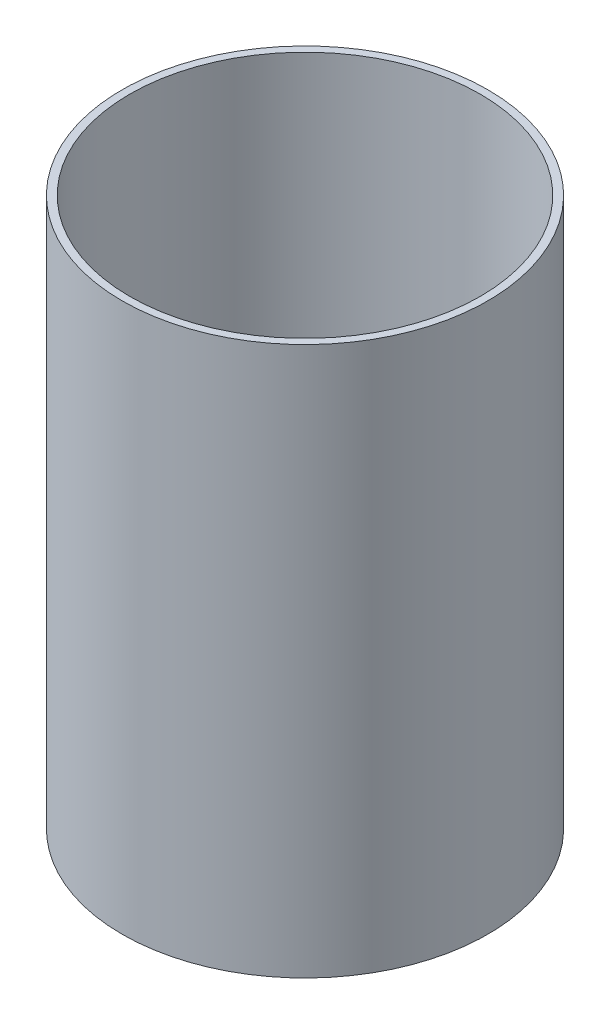
ISO-10303-21;
HEADER;
FILE_DESCRIPTION(('STEP AP214'),'2;1');
FILE_NAME('part.step','',(''),(''),'','','');
FILE_SCHEMA(('AUTOMOTIVE_DESIGN { 1 0 10303 214 1 1 1 1 }'));
ENDSEC;
DATA;
#1=APPLICATION_CONTEXT('core data for automotive mechanical design processes');
#2=APPLICATION_PROTOCOL_DEFINITION('international standard','automotive_design',2000,#1);
#3=PRODUCT_CONTEXT('',#1,'mechanical');
#4=PRODUCT('Part','Part','',(#3));
#5=PRODUCT_RELATED_PRODUCT_CATEGORY('part','',(#4));
#6=PRODUCT_DEFINITION_FORMATION('','',#4);
#7=PRODUCT_DEFINITION_CONTEXT('part definition',#1,'design');
#8=PRODUCT_DEFINITION('design','',#6,#7);
#9=PRODUCT_DEFINITION_SHAPE('','',#8);
#10=(LENGTH_UNIT() NAMED_UNIT(*) SI_UNIT(.MILLI.,.METRE.));
#11=(NAMED_UNIT(*) PLANE_ANGLE_UNIT() SI_UNIT($,.RADIAN.));
#12=(NAMED_UNIT(*) SI_UNIT($,.STERADIAN.) SOLID_ANGLE_UNIT());
#13=UNCERTAINTY_MEASURE_WITH_UNIT(LENGTH_MEASURE(1.E-05),#10,'distance_accuracy_value','');
#14=(GEOMETRIC_REPRESENTATION_CONTEXT(3) GLOBAL_UNCERTAINTY_ASSIGNED_CONTEXT((#13)) GLOBAL_UNIT_ASSIGNED_CONTEXT((#10,
#11,#12)) REPRESENTATION_CONTEXT('',''));
#15=CARTESIAN_POINT('',(0.,0.,0.));
#16=DIRECTION('',(0.,0.,1.));
#17=DIRECTION('',(1.,0.,0.));
#18=AXIS2_PLACEMENT_3D('',#15,#16,#17);
#19=CARTESIAN_POINT('',(0.,457.2,0.));
#20=DIRECTION('',(0.,1.,0.));
#21=DIRECTION('',(0.,0.,1.));
#22=AXIS2_PLACEMENT_3D('',#19,#20,#21);
#23=PLANE('',#22);
#24=CARTESIAN_POINT('',(0.,457.2,0.));
#25=DIRECTION('',(0.,1.,0.));
#26=DIRECTION('',(0.,0.,1.));
#27=AXIS2_PLACEMENT_3D('',#24,#25,#26);
#28=CIRCLE('',#27,152.4);
#29=CARTESIAN_POINT('',(0.,457.2,152.4));
#30=VERTEX_POINT('',#29);
#31=EDGE_CURVE('E10',#30,#30,#28,.T.);
#32=ORIENTED_EDGE('',*,*,#31,.T.);
#33=EDGE_LOOP('',(#32));
#34=FACE_BOUND('',#33,.T.);
#35=CARTESIAN_POINT('',(0.,457.2,0.));
#36=DIRECTION('',(0.,1.,0.));
#37=DIRECTION('',(0.,0.,1.));
#38=AXIS2_PLACEMENT_3D('',#35,#36,#37);
#39=CIRCLE('',#38,146.05);
#40=CARTESIAN_POINT('',(0.,457.2,146.05));
#41=VERTEX_POINT('',#40);
#42=EDGE_CURVE('E44',#41,#41,#39,.T.);
#43=ORIENTED_EDGE('',*,*,#42,.F.);
#44=EDGE_LOOP('',(#43));
#45=FACE_BOUND('',#44,.T.);
#46=ADVANCED_FACE('F33',(#34,#45),#23,.T.);
#47=CARTESIAN_POINT('',(0.,0.,0.));
#48=DIRECTION('',(0.,1.,0.));
#49=DIRECTION('',(0.,0.,1.));
#50=AXIS2_PLACEMENT_3D('',#47,#48,#49);
#51=PLANE('',#50);
#52=CARTESIAN_POINT('',(0.,0.,0.));
#53=DIRECTION('',(0.,1.,0.));
#54=DIRECTION('',(0.,0.,1.));
#55=AXIS2_PLACEMENT_3D('',#52,#53,#54);
#56=CIRCLE('',#55,152.4);
#57=CARTESIAN_POINT('',(0.,0.,152.4));
#58=VERTEX_POINT('',#57);
#59=EDGE_CURVE('E37',#58,#58,#56,.T.);
#60=ORIENTED_EDGE('',*,*,#59,.F.);
#61=EDGE_LOOP('',(#60));
#62=FACE_BOUND('',#61,.T.);
#63=CARTESIAN_POINT('',(0.,0.,0.));
#64=DIRECTION('',(0.,1.,0.));
#65=DIRECTION('',(0.,0.,1.));
#66=AXIS2_PLACEMENT_3D('',#63,#64,#65);
#67=CIRCLE('',#66,146.05);
#68=CARTESIAN_POINT('',(0.,0.,146.05));
#69=VERTEX_POINT('',#68);
#70=EDGE_CURVE('E46',#69,#69,#67,.T.);
#71=ORIENTED_EDGE('',*,*,#70,.T.);
#72=EDGE_LOOP('',(#71));
#73=FACE_BOUND('',#72,.T.);
#74=ADVANCED_FACE('F56',(#62,#73),#51,.F.);
#75=CARTESIAN_POINT('',(0.,457.2,0.));
#76=DIRECTION('',(0.,-1.,0.));
#77=DIRECTION('',(0.,0.,-1.));
#78=AXIS2_PLACEMENT_3D('',#75,#76,#77);
#79=CYLINDRICAL_SURFACE('',#78,152.4);
#80=ORIENTED_EDGE('',*,*,#31,.F.);
#81=EDGE_LOOP('',(#80));
#82=FACE_BOUND('',#81,.T.);
#83=ORIENTED_EDGE('',*,*,#59,.T.);
#84=EDGE_LOOP('',(#83));
#85=FACE_BOUND('',#84,.T.);
#86=ADVANCED_FACE('F35',(#82,#85),#79,.T.);
#87=CARTESIAN_POINT('',(0.,457.2,0.));
#88=DIRECTION('',(0.,-1.,0.));
#89=DIRECTION('',(0.,0.,-1.));
#90=AXIS2_PLACEMENT_3D('',#87,#88,#89);
#91=CYLINDRICAL_SURFACE('',#90,146.05);
#92=ORIENTED_EDGE('',*,*,#42,.T.);
#93=EDGE_LOOP('',(#92));
#94=FACE_BOUND('',#93,.T.);
#95=ORIENTED_EDGE('',*,*,#70,.F.);
#96=EDGE_LOOP('',(#95));
#97=FACE_BOUND('',#96,.T.);
#98=ADVANCED_FACE('F52',(#94,#97),#91,.F.);
#99=CLOSED_SHELL('',(#46,#74,#86,#98));
#100=MANIFOLD_SOLID_BREP('B2',#99);
#101=ADVANCED_BREP_SHAPE_REPRESENTATION('',(#18,#100),#14);
#102=SHAPE_DEFINITION_REPRESENTATION(#9,#101);
ENDSEC;
END-ISO-10303-21;
